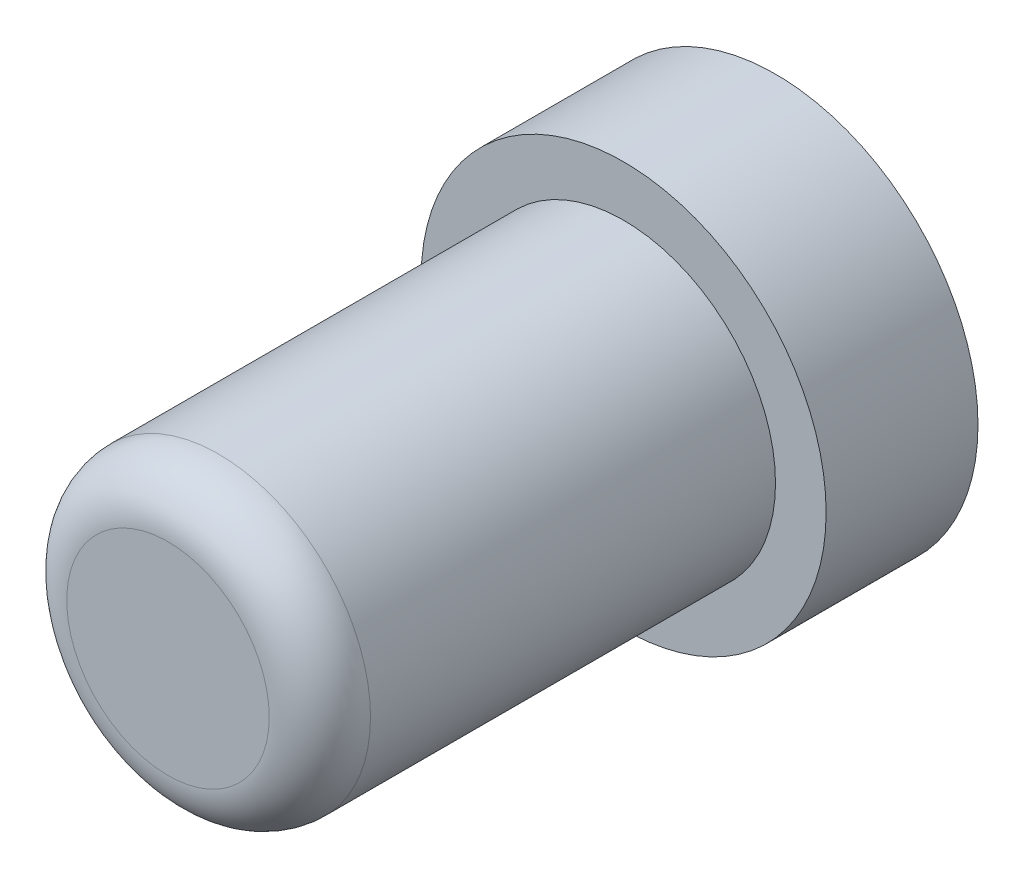
ISO-10303-21;
HEADER;
FILE_DESCRIPTION(('STEP AP214'),'2;1');
FILE_NAME('part.step','',(''),(''),'','','');
FILE_SCHEMA(('AUTOMOTIVE_DESIGN { 1 0 10303 214 1 1 1 1 }'));
ENDSEC;
DATA;
#1=APPLICATION_CONTEXT('core data for automotive mechanical design processes');
#2=APPLICATION_PROTOCOL_DEFINITION('international standard','automotive_design',2000,#1);
#3=PRODUCT_CONTEXT('',#1,'mechanical');
#4=PRODUCT('Part','Part','',(#3));
#5=PRODUCT_RELATED_PRODUCT_CATEGORY('part','',(#4));
#6=PRODUCT_DEFINITION_FORMATION('','',#4);
#7=PRODUCT_DEFINITION_CONTEXT('part definition',#1,'design');
#8=PRODUCT_DEFINITION('design','',#6,#7);
#9=PRODUCT_DEFINITION_SHAPE('','',#8);
#10=(LENGTH_UNIT() NAMED_UNIT(*) SI_UNIT(.MILLI.,.METRE.));
#11=(NAMED_UNIT(*) PLANE_ANGLE_UNIT() SI_UNIT($,.RADIAN.));
#12=(NAMED_UNIT(*) SI_UNIT($,.STERADIAN.) SOLID_ANGLE_UNIT());
#13=UNCERTAINTY_MEASURE_WITH_UNIT(LENGTH_MEASURE(1.E-05),#10,'distance_accuracy_value','');
#14=(GEOMETRIC_REPRESENTATION_CONTEXT(3) GLOBAL_UNCERTAINTY_ASSIGNED_CONTEXT((#13)) GLOBAL_UNIT_ASSIGNED_CONTEXT((#10,
#11,#12)) REPRESENTATION_CONTEXT('',''));
#15=CARTESIAN_POINT('',(0.,0.,0.));
#16=DIRECTION('',(0.,0.,1.));
#17=DIRECTION('',(1.,0.,0.));
#18=AXIS2_PLACEMENT_3D('',#15,#16,#17);
#19=CARTESIAN_POINT('',(0.,0.,1.5));
#20=DIRECTION('',(0.,0.,-1.));
#21=DIRECTION('',(-1.,0.,0.));
#22=AXIS2_PLACEMENT_3D('',#19,#20,#21);
#23=CYLINDRICAL_SURFACE('',#22,2.);
#24=CARTESIAN_POINT('',(0.,0.,1.5));
#25=DIRECTION('',(0.,0.,1.));
#26=DIRECTION('',(1.,0.,0.));
#27=AXIS2_PLACEMENT_3D('',#24,#25,#26);
#28=CIRCLE('',#27,2.);
#29=CARTESIAN_POINT('',(2.,0.,1.5));
#30=VERTEX_POINT('',#29);
#31=EDGE_CURVE('E47',#30,#30,#28,.T.);
#32=ORIENTED_EDGE('',*,*,#31,.F.);
#33=EDGE_LOOP('',(#32));
#34=FACE_BOUND('',#33,.T.);
#35=CARTESIAN_POINT('',(0.,0.,0.));
#36=DIRECTION('',(0.,0.,1.));
#37=DIRECTION('',(1.,0.,0.));
#38=AXIS2_PLACEMENT_3D('',#35,#36,#37);
#39=CIRCLE('',#38,2.);
#40=CARTESIAN_POINT('',(2.,0.,0.));
#41=VERTEX_POINT('',#40);
#42=EDGE_CURVE('E50',#41,#41,#39,.T.);
#43=ORIENTED_EDGE('',*,*,#42,.T.);
#44=EDGE_LOOP('',(#43));
#45=FACE_BOUND('',#44,.T.);
#46=ADVANCED_FACE('F32',(#34,#45),#23,.T.);
#47=CARTESIAN_POINT('',(0.,0.,1.5));
#48=DIRECTION('',(0.,0.,1.));
#49=DIRECTION('',(1.,0.,0.));
#50=AXIS2_PLACEMENT_3D('',#47,#48,#49);
#51=PLANE('',#50);
#52=CARTESIAN_POINT('',(0.,0.,1.5));
#53=DIRECTION('',(0.,0.,1.));
#54=DIRECTION('',(1.,0.,0.));
#55=AXIS2_PLACEMENT_3D('',#52,#53,#54);
#56=CIRCLE('',#55,1.5);
#57=CARTESIAN_POINT('',(1.5,0.,1.5));
#58=VERTEX_POINT('',#57);
#59=EDGE_CURVE('E43',#58,#58,#56,.T.);
#60=ORIENTED_EDGE('',*,*,#59,.F.);
#61=EDGE_LOOP('',(#60));
#62=FACE_BOUND('',#61,.T.);
#63=ORIENTED_EDGE('',*,*,#31,.T.);
#64=EDGE_LOOP('',(#63));
#65=FACE_BOUND('',#64,.T.);
#66=ADVANCED_FACE('F56',(#62,#65),#51,.T.);
#67=CARTESIAN_POINT('',(0.,0.,0.));
#68=DIRECTION('',(0.,0.,1.));
#69=DIRECTION('',(1.,0.,0.));
#70=AXIS2_PLACEMENT_3D('',#67,#68,#69);
#71=PLANE('',#70);
#72=ORIENTED_EDGE('',*,*,#42,.F.);
#73=EDGE_LOOP('',(#72));
#74=FACE_BOUND('',#73,.T.);
#75=ADVANCED_FACE('F62',(#74),#71,.F.);
#76=CARTESIAN_POINT('',(0.,0.,6.));
#77=DIRECTION('',(0.,0.,-1.));
#78=DIRECTION('',(-1.,0.,0.));
#79=AXIS2_PLACEMENT_3D('',#76,#77,#78);
#80=CYLINDRICAL_SURFACE('',#79,1.5);
#81=CARTESIAN_POINT('',(0.,0.,5.5));
#82=DIRECTION('',(0.,0.,1.));
#83=DIRECTION('',(1.,0.,0.));
#84=AXIS2_PLACEMENT_3D('',#81,#82,#83);
#85=CIRCLE('',#84,1.5);
#86=CARTESIAN_POINT('',(1.5,0.,5.5));
#87=VERTEX_POINT('',#86);
#88=EDGE_CURVE('E10',#87,#87,#85,.F.);
#89=ORIENTED_EDGE('',*,*,#88,.T.);
#90=EDGE_LOOP('',(#89));
#91=FACE_BOUND('',#90,.T.);
#92=ORIENTED_EDGE('',*,*,#59,.T.);
#93=EDGE_LOOP('',(#92));
#94=FACE_BOUND('',#93,.T.);
#95=ADVANCED_FACE('F64',(#91,#94),#80,.T.);
#96=CARTESIAN_POINT('',(0.,0.,6.));
#97=DIRECTION('',(0.,0.,1.));
#98=DIRECTION('',(1.,0.,0.));
#99=AXIS2_PLACEMENT_3D('',#96,#97,#98);
#100=PLANE('',#99);
#101=CARTESIAN_POINT('',(0.,0.,6.));
#102=DIRECTION('',(0.,0.,1.));
#103=DIRECTION('',(1.,0.,0.));
#104=AXIS2_PLACEMENT_3D('',#101,#102,#103);
#105=CIRCLE('',#104,1.);
#106=CARTESIAN_POINT('',(1.,0.,6.));
#107=VERTEX_POINT('',#106);
#108=EDGE_CURVE('E39',#107,#107,#105,.T.);
#109=ORIENTED_EDGE('',*,*,#108,.T.);
#110=EDGE_LOOP('',(#109));
#111=FACE_BOUND('',#110,.T.);
#112=ADVANCED_FACE('F70',(#111),#100,.T.);
#113=CARTESIAN_POINT('',(0.,0.,5.5));
#114=DIRECTION('',(0.,0.,1.));
#115=DIRECTION('',(1.,0.,0.));
#116=AXIS2_PLACEMENT_3D('',#113,#114,#115);
#117=TOROIDAL_SURFACE('',#116,1.,0.5);
#118=ORIENTED_EDGE('',*,*,#88,.F.);
#119=EDGE_LOOP('',(#118));
#120=FACE_BOUND('',#119,.T.);
#121=ORIENTED_EDGE('',*,*,#108,.F.);
#122=EDGE_LOOP('',(#121));
#123=FACE_BOUND('',#122,.T.);
#124=ADVANCED_FACE('F34',(#120,#123),#117,.T.);
#125=CLOSED_SHELL('',(#46,#66,#75,#95,#112,#124));
#126=MANIFOLD_SOLID_BREP('B2',#125);
#127=ADVANCED_BREP_SHAPE_REPRESENTATION('',(#18,#126),#14);
#128=SHAPE_DEFINITION_REPRESENTATION(#9,#127);
ENDSEC;
END-ISO-10303-21;
